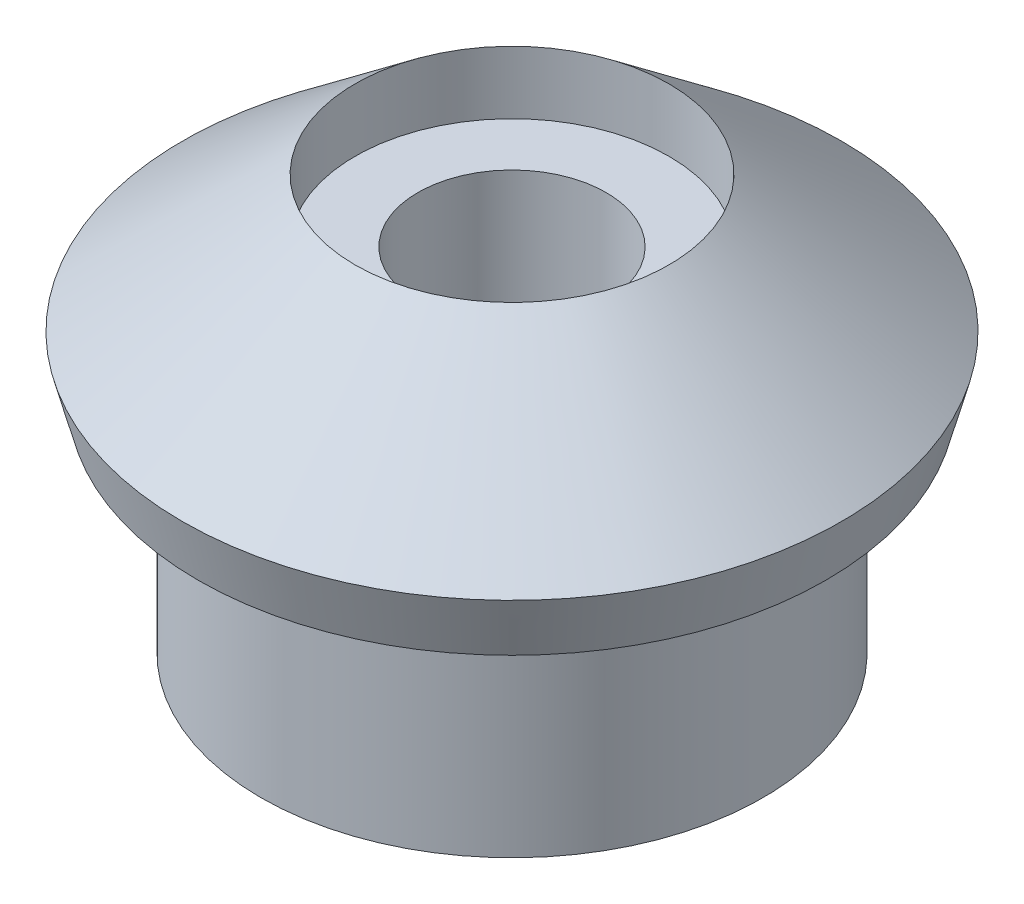
ISO-10303-21;
HEADER;
FILE_DESCRIPTION(('STEP AP214'),'2;1');
FILE_NAME('part.step','',(''),(''),'','','');
FILE_SCHEMA(('AUTOMOTIVE_DESIGN { 1 0 10303 214 1 1 1 1 }'));
ENDSEC;
DATA;
#1=APPLICATION_CONTEXT('core data for automotive mechanical design processes');
#2=APPLICATION_PROTOCOL_DEFINITION('international standard','automotive_design',2000,#1);
#3=PRODUCT_CONTEXT('',#1,'mechanical');
#4=PRODUCT('Part','Part','',(#3));
#5=PRODUCT_RELATED_PRODUCT_CATEGORY('part','',(#4));
#6=PRODUCT_DEFINITION_FORMATION('','',#4);
#7=PRODUCT_DEFINITION_CONTEXT('part definition',#1,'design');
#8=PRODUCT_DEFINITION('design','',#6,#7);
#9=PRODUCT_DEFINITION_SHAPE('','',#8);
#10=(LENGTH_UNIT() NAMED_UNIT(*) SI_UNIT(.MILLI.,.METRE.));
#11=(NAMED_UNIT(*) PLANE_ANGLE_UNIT() SI_UNIT($,.RADIAN.));
#12=(NAMED_UNIT(*) SI_UNIT($,.STERADIAN.) SOLID_ANGLE_UNIT());
#13=UNCERTAINTY_MEASURE_WITH_UNIT(LENGTH_MEASURE(1.E-05),#10,'distance_accuracy_value','');
#14=(GEOMETRIC_REPRESENTATION_CONTEXT(3) GLOBAL_UNCERTAINTY_ASSIGNED_CONTEXT((#13)) GLOBAL_UNIT_ASSIGNED_CONTEXT((#10,
#11,#12)) REPRESENTATION_CONTEXT('',''));
#15=CARTESIAN_POINT('',(0.,0.,0.));
#16=DIRECTION('',(0.,0.,1.));
#17=DIRECTION('',(1.,0.,0.));
#18=AXIS2_PLACEMENT_3D('',#15,#16,#17);
#19=CARTESIAN_POINT('',(0.,11.2,0.));
#20=DIRECTION('',(0.,-1.,0.));
#21=DIRECTION('',(0.,0.,1.));
#22=AXIS2_PLACEMENT_3D('',#19,#20,#21);
#23=PLANE('',#22);
#24=CARTESIAN_POINT('',(0.,11.2,0.));
#25=DIRECTION('',(0.,1.,0.));
#26=DIRECTION('',(0.,0.,1.));
#27=AXIS2_PLACEMENT_3D('',#24,#25,#26);
#28=CIRCLE('',#27,3.);
#29=CARTESIAN_POINT('',(0.,11.2,3.));
#30=VERTEX_POINT('',#29);
#31=EDGE_CURVE('E61',#30,#30,#28,.T.);
#32=ORIENTED_EDGE('',*,*,#31,.F.);
#33=EDGE_LOOP('',(#32));
#34=FACE_BOUND('',#33,.T.);
#35=CARTESIAN_POINT('',(0.,11.2,0.));
#36=DIRECTION('',(0.,-1.,0.));
#37=DIRECTION('',(0.,0.,-1.));
#38=AXIS2_PLACEMENT_3D('',#35,#36,#37);
#39=CIRCLE('',#38,5.);
#40=CARTESIAN_POINT('',(0.,11.2,-5.));
#41=VERTEX_POINT('',#40);
#42=EDGE_CURVE('E10',#41,#41,#39,.T.);
#43=ORIENTED_EDGE('',*,*,#42,.F.);
#44=EDGE_LOOP('',(#43));
#45=FACE_BOUND('',#44,.T.);
#46=ADVANCED_FACE('F32',(#34,#45),#23,.F.);
#47=CARTESIAN_POINT('',(0.,56.9416656123482,0.));
#48=DIRECTION('',(0.,1.,0.));
#49=DIRECTION('',(0.,0.,-1.));
#50=AXIS2_PLACEMENT_3D('',#47,#48,#49);
#51=CYLINDRICAL_SURFACE('',#50,5.);
#52=ORIENTED_EDGE('',*,*,#42,.T.);
#53=EDGE_LOOP('',(#52));
#54=FACE_BOUND('',#53,.T.);
#55=CARTESIAN_POINT('',(0.,13.2,0.));
#56=DIRECTION('',(0.,-1.,0.));
#57=DIRECTION('',(0.,0.,-1.));
#58=AXIS2_PLACEMENT_3D('',#55,#56,#57);
#59=CIRCLE('',#58,5.);
#60=CARTESIAN_POINT('',(0.,13.2,-5.));
#61=VERTEX_POINT('',#60);
#62=EDGE_CURVE('E43',#61,#61,#59,.T.);
#63=ORIENTED_EDGE('',*,*,#62,.F.);
#64=EDGE_LOOP('',(#63));
#65=FACE_BOUND('',#64,.T.);
#66=ADVANCED_FACE('F91',(#54,#65),#51,.F.);
#67=CARTESIAN_POINT('',(0.,8.86987298107782,0.));
#68=DIRECTION('',(0.,-1.,0.));
#69=DIRECTION('',(0.,0.,1.));
#70=AXIS2_PLACEMENT_3D('',#67,#68,#69);
#71=CONICAL_SURFACE('',#70,10.5,0.903849982291234);
#72=ORIENTED_EDGE('',*,*,#62,.T.);
#73=EDGE_LOOP('',(#72));
#74=FACE_BOUND('',#73,.T.);
#75=CARTESIAN_POINT('',(0.,8.86987298107782,0.));
#76=DIRECTION('',(0.,-1.,0.));
#77=DIRECTION('',(0.,0.,-1.));
#78=AXIS2_PLACEMENT_3D('',#75,#76,#77);
#79=CIRCLE('',#78,10.5);
#80=CARTESIAN_POINT('',(0.,8.86987298107782,-10.5));
#81=VERTEX_POINT('',#80);
#82=EDGE_CURVE('E47',#81,#81,#79,.T.);
#83=ORIENTED_EDGE('',*,*,#82,.F.);
#84=EDGE_LOOP('',(#83));
#85=FACE_BOUND('',#84,.T.);
#86=ADVANCED_FACE('F88',(#74,#85),#71,.T.);
#87=CARTESIAN_POINT('',(0.,7.,0.));
#88=DIRECTION('',(0.,1.,0.));
#89=DIRECTION('',(0.,0.,-1.));
#90=AXIS2_PLACEMENT_3D('',#87,#88,#89);
#91=CONICAL_SURFACE('',#90,10.,0.261284899996137);
#92=ORIENTED_EDGE('',*,*,#82,.T.);
#93=EDGE_LOOP('',(#92));
#94=FACE_BOUND('',#93,.T.);
#95=CARTESIAN_POINT('',(0.,7.,0.));
#96=DIRECTION('',(0.,-1.,0.));
#97=DIRECTION('',(0.,0.,-1.));
#98=AXIS2_PLACEMENT_3D('',#95,#96,#97);
#99=CIRCLE('',#98,10.);
#100=CARTESIAN_POINT('',(0.,7.,-10.));
#101=VERTEX_POINT('',#100);
#102=EDGE_CURVE('E52',#101,#101,#99,.T.);
#103=ORIENTED_EDGE('',*,*,#102,.F.);
#104=EDGE_LOOP('',(#103));
#105=FACE_BOUND('',#104,.T.);
#106=ADVANCED_FACE('F84',(#94,#105),#91,.T.);
#107=CARTESIAN_POINT('',(0.,7.,10.));
#108=DIRECTION('',(0.,1.,0.));
#109=DIRECTION('',(0.,0.,-1.));
#110=AXIS2_PLACEMENT_3D('',#107,#108,#109);
#111=PLANE('',#110);
#112=ORIENTED_EDGE('',*,*,#102,.T.);
#113=EDGE_LOOP('',(#112));
#114=FACE_BOUND('',#113,.T.);
#115=CARTESIAN_POINT('',(0.,7.,0.));
#116=DIRECTION('',(0.,-1.,0.));
#117=DIRECTION('',(0.,0.,-1.));
#118=AXIS2_PLACEMENT_3D('',#115,#116,#117);
#119=CIRCLE('',#118,8.);
#120=CARTESIAN_POINT('',(0.,7.,-8.));
#121=VERTEX_POINT('',#120);
#122=EDGE_CURVE('E55',#121,#121,#119,.T.);
#123=ORIENTED_EDGE('',*,*,#122,.F.);
#124=EDGE_LOOP('',(#123));
#125=FACE_BOUND('',#124,.T.);
#126=ADVANCED_FACE('F80',(#114,#125),#111,.F.);
#127=CARTESIAN_POINT('',(0.,56.9416656123482,0.));
#128=DIRECTION('',(0.,1.,0.));
#129=DIRECTION('',(0.,0.,-1.));
#130=AXIS2_PLACEMENT_3D('',#127,#128,#129);
#131=CYLINDRICAL_SURFACE('',#130,8.);
#132=CARTESIAN_POINT('',(-7.85811682275086,3.,1.5));
#133=CARTESIAN_POINT('',(-7.85811843793494,3.08345720801174,1.49999679883246));
#134=CARTESIAN_POINT('',(-7.85946079760266,3.16695594821839,1.49301126348936));
#135=CARTESIAN_POINT('',(-7.86467851014364,3.33159896158191,1.46527253251805));
#136=CARTESIAN_POINT('',(-7.86855601173205,3.41274117642748,1.44450765768477));
#137=CARTESIAN_POINT('',(-7.87838976464885,3.57026507137088,1.38987035617788));
#138=CARTESIAN_POINT('',(-7.88434407905997,3.64665110930729,1.35601013954374));
#139=CARTESIAN_POINT('',(-7.89765826320959,3.79265355928681,1.27617565760366));
#140=CARTESIAN_POINT('',(-7.90501802325622,3.8622704990033,1.23020233759193));
#141=CARTESIAN_POINT('',(-7.92041614838944,3.99363019919913,1.12683678942622));
#142=CARTESIAN_POINT('',(-7.92846116625679,4.05527648347173,1.06932292933092));
#143=CARTESIAN_POINT('',(-7.94426457664034,4.16810438959956,0.944771778803551));
#144=CARTESIAN_POINT('',(-7.95202295031153,4.21928532442479,0.877733863624944));
#145=CARTESIAN_POINT('',(-7.96645017828405,4.31009937660052,0.735403894570162));
#146=CARTESIAN_POINT('',(-7.97311028052363,4.34964153351942,0.660052840033865));
#147=CARTESIAN_POINT('',(-7.98451608632931,4.41546954227353,0.503631283250762));
#148=CARTESIAN_POINT('',(-7.98926194728334,4.44175648399022,0.422561251859505));
#149=CARTESIAN_POINT('',(-7.99625755123778,4.48002954861113,0.258002746187416));
#150=CARTESIAN_POINT('',(-7.99853565976327,4.49217830592269,0.174553323244857));
#151=CARTESIAN_POINT('',(-8.00043684615594,4.5023368877004,0.00677167603538285));
#152=CARTESIAN_POINT('',(-8.00006015010697,4.50034791613906,-0.0775604724476705));
#153=CARTESIAN_POINT('',(-7.99671633763241,4.48241222885285,-0.243598357899397));
#154=CARTESIAN_POINT('',(-7.99378172247214,4.46664063056999,-0.325323760451469));
#155=CARTESIAN_POINT('',(-7.98568826333561,4.42186435060476,-0.484947165715476));
#156=CARTESIAN_POINT('',(-7.98052933829966,4.3928591866542,-0.562845028826541));
#157=CARTESIAN_POINT('',(-7.96851260297339,4.3222722689417,-0.713110065751521));
#158=CARTESIAN_POINT('',(-7.96164537590825,4.2806205120875,-0.785443571838533));
#159=CARTESIAN_POINT('',(-7.9469714754285,4.18597433092285,-0.922159977214638));
#160=CARTESIAN_POINT('',(-7.93916470651164,4.13297875311242,-0.986542066910785));
#161=CARTESIAN_POINT('',(-7.92333513680567,4.01618429701647,-1.10656561896904));
#162=CARTESIAN_POINT('',(-7.91531085901622,3.95223221609793,-1.16205790757041));
#163=CARTESIAN_POINT('',(-7.90006508924621,3.81585046872137,-1.26155171851261));
#164=CARTESIAN_POINT('',(-7.89284360901351,3.74342067823536,-1.30555307271182));
#165=CARTESIAN_POINT('',(-7.88001893307121,3.59194172929734,-1.38085852224478));
#166=CARTESIAN_POINT('',(-7.87441850530261,3.51288154280936,-1.41214093645421));
#167=CARTESIAN_POINT('',(-7.86551242396689,3.3504988158768,-1.46093656975056));
#168=CARTESIAN_POINT('',(-7.8622065103862,3.26717675953522,-1.47845134901108));
#169=CARTESIAN_POINT('',(-7.85831520301005,3.09998067114412,-1.49899672649739));
#170=CARTESIAN_POINT('',(-7.85768955816136,3.01613388443449,-1.50224164285859));
#171=CARTESIAN_POINT('',(-7.8591219142084,2.84909654491285,-1.49472968881724));
#172=CARTESIAN_POINT('',(-7.86117978238611,2.76590595985192,-1.48397351086433));
#173=CARTESIAN_POINT('',(-7.86770980063205,2.60324709694561,-1.44894868195883));
#174=CARTESIAN_POINT('',(-7.87216186690878,2.5237537473751,-1.4247923858399));
#175=CARTESIAN_POINT('',(-7.88296134156619,2.36994281026984,-1.3637722437906));
#176=CARTESIAN_POINT('',(-7.88930888963281,2.29562560468467,-1.32690746128795));
#177=CARTESIAN_POINT('',(-7.90327577863685,2.15333238095683,-1.2410235311966));
#178=CARTESIAN_POINT('',(-7.91090895425315,2.08543946213393,-1.19186899639621));
#179=CARTESIAN_POINT('',(-7.926548113681,1.95878795978567,-1.08298344344247));
#180=CARTESIAN_POINT('',(-7.93455413096494,1.90003019844423,-1.02325147433084));
#181=CARTESIAN_POINT('',(-7.95016624005946,1.79251623646587,-0.893949417870385));
#182=CARTESIAN_POINT('',(-7.95776555833305,1.74390417339403,-0.82425853409589));
#183=CARTESIAN_POINT('',(-7.97159404810351,1.65907879382234,-0.67757452304014));
#184=CARTESIAN_POINT('',(-7.97782327234725,1.62286499997499,-0.600581677038528));
#185=CARTESIAN_POINT('',(-7.98818057995848,1.56407990213592,-0.441877541578684));
#186=CARTESIAN_POINT('',(-7.99231954730142,1.54143781243859,-0.360193213078987));
#187=CARTESIAN_POINT('',(-7.99807642083745,1.51021295171011,-0.19409622738157));
#188=CARTESIAN_POINT('',(-7.99969459229933,1.50162870133729,-0.10968385821585));
#189=CARTESIAN_POINT('',(-8.00022227515441,1.49881469848156,0.0580907602505099));
#190=CARTESIAN_POINT('',(-7.99917286625032,1.50436724687047,0.141449307066269));
#191=CARTESIAN_POINT('',(-7.99456866611703,1.52919242776844,0.3060233692792));
#192=CARTESIAN_POINT('',(-7.99101389890671,1.54846492874421,0.38723890521369));
#193=CARTESIAN_POINT('',(-7.98179837978045,1.60009120738372,0.545106475595485));
#194=CARTESIAN_POINT('',(-7.97614135981576,1.63242181288101,0.621766319318224));
#195=CARTESIAN_POINT('',(-7.96333372068771,1.70922045365518,0.768605631316695));
#196=CARTESIAN_POINT('',(-7.95618300146483,1.75368930210665,0.838784665003271));
#197=CARTESIAN_POINT('',(-7.94104779859941,1.85425145444232,0.971755027780007));
#198=CARTESIAN_POINT('',(-7.93305284591272,1.91050203386171,1.03442623539053));
#199=CARTESIAN_POINT('',(-7.91719633538833,2.03270456249271,1.14951536065485));
#200=CARTESIAN_POINT('',(-7.90933480936765,2.09865879037372,1.2019308632478));
#201=CARTESIAN_POINT('',(-7.89455577425926,2.23912645470334,1.29547633945385));
#202=CARTESIAN_POINT('',(-7.88764767280729,2.31371343966764,1.33649740531872));
#203=CARTESIAN_POINT('',(-7.87567084650033,2.46882578997974,1.40536132423417));
#204=CARTESIAN_POINT('',(-7.87060038649116,2.54934546658938,1.43321661638912));
#205=CARTESIAN_POINT('',(-7.86393016292125,2.69175228806592,1.46929726596175));
#206=CARTESIAN_POINT('',(-7.86176310717932,2.75280572376195,1.4807910573985));
#207=CARTESIAN_POINT('',(-7.85885585595504,2.87589846842032,1.49614351076215));
#208=CARTESIAN_POINT('',(-7.85811562163282,2.93793775050033,1.50000238052127));
#209=CARTESIAN_POINT('',(-7.85811682275086,3.,1.5));
#210=B_SPLINE_CURVE_WITH_KNOTS('',3,(#132,#133,#134,#135,#136,#137,#138,#139,#140,#141,#142,
#143,#144,#145,#146,#147,#148,#149,#150,#151,#152,#153,#154,#155,#156,#157,#158,#159,#160,#161,
#162,#163,#164,#165,#166,#167,#168,#169,#170,#171,#172,#173,#174,#175,#176,#177,#178,#179,#180,
#181,#182,#183,#184,#185,#186,#187,#188,#189,#190,#191,#192,#193,#194,#195,#196,#197,#198,#199,
#200,#201,#202,#203,#204,#205,#206,#207,#208,#209),.UNSPECIFIED.,.T.,.F.,(4,2,2,2,2,2,2,2,2,2,2,
2,2,2,2,2,2,2,2,2,2,2,2,2,2,2,2,2,2,2,2,2,2,2,2,2,2,2,4),(0.,0.250144505793187,
0.500501302380393,0.750625227978433,1.00072963993908,1.25362335698691,1.50653367069315,
1.76137104348047,2.0161874593964,2.26804275460261,2.51987660200648,2.76855650598725,
3.01724547328425,3.26733691984219,3.51745380911785,3.77140614764064,4.025362201924,
4.27974936118266,4.53410768866488,4.78463248587075,5.03514489338718,5.28358792315369,
5.53204926624317,5.78337862654144,6.03473059394677,6.28944125495871,6.54414210821705,
6.79750269418683,7.0508366166733,7.30029300570138,7.54974700322167,7.79876026530358,
8.0477902135711,8.30038464008745,8.55303847730765,8.80803001818118,9.06278015749119,
9.24880307527215,9.43482092920425),.UNSPECIFIED.);
#211=CARTESIAN_POINT('',(-7.85811682275086,3.,1.5));
#212=VERTEX_POINT('',#211);
#213=EDGE_CURVE('E67',#212,#212,#210,.T.);
#214=ORIENTED_EDGE('',*,*,#213,.F.);
#215=EDGE_LOOP('',(#214));
#216=FACE_BOUND('',#215,.T.);
#217=ORIENTED_EDGE('',*,*,#122,.T.);
#218=EDGE_LOOP('',(#217));
#219=FACE_BOUND('',#218,.T.);
#220=CARTESIAN_POINT('',(0.,0.,0.));
#221=DIRECTION('',(0.,-1.,0.));
#222=DIRECTION('',(0.,0.,-1.));
#223=AXIS2_PLACEMENT_3D('',#220,#221,#222);
#224=CIRCLE('',#223,8.);
#225=CARTESIAN_POINT('',(0.,0.,-8.));
#226=VERTEX_POINT('',#225);
#227=EDGE_CURVE('E58',#226,#226,#224,.T.);
#228=ORIENTED_EDGE('',*,*,#227,.F.);
#229=EDGE_LOOP('',(#228));
#230=FACE_BOUND('',#229,.T.);
#231=ADVANCED_FACE('F74',(#216,#219,#230),#131,.T.);
#232=CARTESIAN_POINT('',(0.,0.,8.));
#233=DIRECTION('',(0.,1.,0.));
#234=DIRECTION('',(0.,0.,-1.));
#235=AXIS2_PLACEMENT_3D('',#232,#233,#234);
#236=PLANE('',#235);
#237=CARTESIAN_POINT('',(0.,0.,0.));
#238=DIRECTION('',(0.,1.,0.));
#239=DIRECTION('',(0.,0.,1.));
#240=AXIS2_PLACEMENT_3D('',#237,#238,#239);
#241=CIRCLE('',#240,3.);
#242=CARTESIAN_POINT('',(0.,0.,3.));
#243=VERTEX_POINT('',#242);
#244=EDGE_CURVE('E64',#243,#243,#241,.T.);
#245=ORIENTED_EDGE('',*,*,#244,.T.);
#246=EDGE_LOOP('',(#245));
#247=FACE_BOUND('',#246,.T.);
#248=ORIENTED_EDGE('',*,*,#227,.T.);
#249=EDGE_LOOP('',(#248));
#250=FACE_BOUND('',#249,.T.);
#251=ADVANCED_FACE('F79',(#247,#250),#236,.F.);
#252=CARTESIAN_POINT('',(0.,13.2,0.));
#253=DIRECTION('',(0.,-1.,0.));
#254=DIRECTION('',(0.,0.,1.));
#255=AXIS2_PLACEMENT_3D('',#252,#253,#254);
#256=CYLINDRICAL_SURFACE('',#255,3.);
#257=CARTESIAN_POINT('',(-2.59807621135332,3.,1.5));
#258=CARTESIAN_POINT('',(-2.59808302092689,2.92183828770712,1.4999945446118));
#259=CARTESIAN_POINT('',(-2.60165701781635,2.84357788271243,1.49384995609983));
#260=CARTESIAN_POINT('',(-2.61543549678079,2.68945910298427,1.46958481484708));
#261=CARTESIAN_POINT('',(-2.62565391083339,2.61360612743489,1.45143909683127));
#262=CARTESIAN_POINT('',(-2.65124019908098,2.46682250348409,1.40414992304972));
#263=CARTESIAN_POINT('',(-2.66658065209878,2.39586802128962,1.3750649287406));
#264=CARTESIAN_POINT('',(-2.70063997225287,2.25986369700492,1.30690128806456));
#265=CARTESIAN_POINT('',(-2.71935902214097,2.19481417460631,1.26782210105366));
#266=CARTESIAN_POINT('',(-2.75995303586162,2.06654140716374,1.17699981079632));
#267=CARTESIAN_POINT('',(-2.7819609545693,2.00391129648968,1.12447805421566));
#268=CARTESIAN_POINT('',(-2.82557974178559,1.88788741738994,1.0098807114217));
#269=CARTESIAN_POINT('',(-2.84719040746875,1.83449825612472,0.94780038867344));
#270=CARTESIAN_POINT('',(-2.88932215429424,1.73494927327851,0.81073434512182));
#271=CARTESIAN_POINT('',(-2.90967159627259,1.6895193482107,0.735160783518863));
#272=CARTESIAN_POINT('',(-2.94526134149293,1.61228872013136,0.576235539899256));
#273=CARTESIAN_POINT('',(-2.96050486775612,1.58047941579424,0.492888807207233));
#274=CARTESIAN_POINT('',(-2.98320691866356,1.53374300804835,0.327067415888966));
#275=CARTESIAN_POINT('',(-2.99114220331338,1.5177757104667,0.244952685733227));
#276=CARTESIAN_POINT('',(-3.00011375769101,1.49975082198744,0.0788559430467725));
#277=CARTESIAN_POINT('',(-3.00115420176885,1.49768481480643,-0.00512490876560739));
#278=CARTESIAN_POINT('',(-2.99644472874675,1.50712001095552,-0.164748786635625));
#279=CARTESIAN_POINT('',(-2.99127743838241,1.51745702328183,-0.240481798765187));
#280=CARTESIAN_POINT('',(-2.97561367889621,1.54932126585699,-0.388970657877483));
#281=CARTESIAN_POINT('',(-2.96511681099591,1.57084933346433,-0.461726281640888));
#282=CARTESIAN_POINT('',(-2.93957374931482,1.62462384913472,-0.60346408735433));
#283=CARTESIAN_POINT('',(-2.92446662293799,1.6570144697581,-0.672380135272767));
#284=CARTESIAN_POINT('',(-2.89106468980031,1.73139512430224,-0.803965202269993));
#285=CARTESIAN_POINT('',(-2.87276874236226,1.77338859495352,-0.866631973257968));
#286=CARTESIAN_POINT('',(-2.83266591598844,1.87034302729952,-0.990260491347292));
#287=CARTESIAN_POINT('',(-2.81069063997263,1.92615454248901,-1.05050111254404));
#288=CARTESIAN_POINT('',(-2.76681510880218,2.04688458739526,-1.16115655544667));
#289=CARTESIAN_POINT('',(-2.74491492398443,2.11181005841109,-1.21156381736135));
#290=CARTESIAN_POINT('',(-2.70216234138727,2.25397228863613,-1.30425800196332));
#291=CARTESIAN_POINT('',(-2.68146479986061,2.33172903458132,-1.34582597246708));
#292=CARTESIAN_POINT('',(-2.64563175417864,2.4944065070385,-1.41497866950185));
#293=CARTESIAN_POINT('',(-2.63049045069101,2.57931964952634,-1.44257798731633));
#294=CARTESIAN_POINT('',(-2.60916953725552,2.74682176692419,-1.48077031653756));
#295=CARTESIAN_POINT('',(-2.60237483772745,2.82906167856533,-1.49253768317996));
#296=CARTESIAN_POINT('',(-2.59676879042414,2.99460201227481,-1.50227541991714));
#297=CARTESIAN_POINT('',(-2.59795180333967,3.07790164367968,-1.50025553597254));
#298=CARTESIAN_POINT('',(-2.60751504810877,3.23348087786809,-1.48355406501595));
#299=CARTESIAN_POINT('',(-2.61509381259981,3.30596917666189,-1.4702817250687));
#300=CARTESIAN_POINT('',(-2.63541032327012,3.44755167940644,-1.43354442694866));
#301=CARTESIAN_POINT('',(-2.64814974007551,3.51664477611991,-1.41007616793542));
#302=CARTESIAN_POINT('',(-2.67804333119485,3.65311699635404,-1.35247138290733));
#303=CARTESIAN_POINT('',(-2.69537464864595,3.72026852528033,-1.31789109553909));
#304=CARTESIAN_POINT('',(-2.73234179245875,3.84820390730849,-1.23943059602371));
#305=CARTESIAN_POINT('',(-2.75197880032721,3.90898446526993,-1.19554560649832));
#306=CARTESIAN_POINT('',(-2.79431997684504,4.03046815128532,-1.09325575079828));
#307=CARTESIAN_POINT('',(-2.81709874731434,4.09019572607649,-1.03371790847245));
#308=CARTESIAN_POINT('',(-2.86101352466839,4.19911835699039,-0.905106743097433));
#309=CARTESIAN_POINT('',(-2.88214897511564,4.24830985534581,-0.836030211983021));
#310=CARTESIAN_POINT('',(-2.92112042536435,4.33586058892515,-0.687803043838136));
#311=CARTESIAN_POINT('',(-2.93885462508044,4.37389967731637,-0.60843464636117));
#312=CARTESIAN_POINT('',(-2.96825032438951,4.43570685578609,-0.443283546961623));
#313=CARTESIAN_POINT('',(-2.9799171551456,4.45948747704946,-0.357506552088264));
#314=CARTESIAN_POINT('',(-2.99501262272824,4.49005284626199,-0.190469523495626));
#315=CARTESIAN_POINT('',(-2.99909891862287,4.49819681381417,-0.109517165775686));
#316=CARTESIAN_POINT('',(-3.00063195562697,4.5012648981816,0.052688978926805));
#317=CARTESIAN_POINT('',(-2.99808102100335,4.49619364278535,0.13394265044263));
#318=CARTESIAN_POINT('',(-2.98700953256884,4.47387538980656,0.28880698847572));
#319=CARTESIAN_POINT('',(-2.97889342001985,4.45745272611349,0.362568476716895));
#320=CARTESIAN_POINT('',(-2.95788140495135,4.41400950104554,0.506168928275426));
#321=CARTESIAN_POINT('',(-2.94498481699194,4.38698741985982,0.576007327433263));
#322=CARTESIAN_POINT('',(-2.9148889612218,4.32190942175104,0.713135109367327));
#323=CARTESIAN_POINT('',(-2.89752925798199,4.28343101518824,0.780187714050069));
#324=CARTESIAN_POINT('',(-2.86032199712739,4.19706310371143,0.907161962721037));
#325=CARTESIAN_POINT('',(-2.84047329837541,4.14916927632649,0.967080311122361));
#326=CARTESIAN_POINT('',(-2.79792915339941,4.03980429146595,1.08437100623534));
#327=CARTESIAN_POINT('',(-2.77514698517547,3.97745626878421,1.14089652680891));
#328=CARTESIAN_POINT('',(-2.73094614244278,3.84382391830534,1.24299493109201));
#329=CARTESIAN_POINT('',(-2.70952868642798,3.77253176869847,1.28855812501509));
#330=CARTESIAN_POINT('',(-2.66999407957374,3.62004503012857,1.36864661967848));
#331=CARTESIAN_POINT('',(-2.65200261384405,3.5386087033069,1.40277759894141));
#332=CARTESIAN_POINT('',(-2.62299234492527,3.37000139349033,1.45631806425962));
#333=CARTESIAN_POINT('',(-2.61195024221553,3.28285066663097,1.47577678676302));
#334=CARTESIAN_POINT('',(-2.60293908902686,3.16229196652201,1.49155051179662));
#335=CARTESIAN_POINT('',(-2.60112193507728,3.12994815840318,1.49471415744578));
#336=CARTESIAN_POINT('',(-2.59868903831625,3.06507527897664,1.49894010763494));
#337=CARTESIAN_POINT('',(-2.59807337587664,3.03254619542119,1.50000227159981));
#338=CARTESIAN_POINT('',(-2.59807621135332,3.,1.5));
#339=B_SPLINE_CURVE_WITH_KNOTS('',3,(#257,#258,#259,#260,#261,#262,#263,#264,#265,#266,#267,
#268,#269,#270,#271,#272,#273,#274,#275,#276,#277,#278,#279,#280,#281,#282,#283,#284,#285,#286,
#287,#288,#289,#290,#291,#292,#293,#294,#295,#296,#297,#298,#299,#300,#301,#302,#303,#304,#305,
#306,#307,#308,#309,#310,#311,#312,#313,#314,#315,#316,#317,#318,#319,#320,#321,#322,#323,#324,
#325,#326,#327,#328,#329,#330,#331,#332,#333,#334,#335,#336,#337,#338),.UNSPECIFIED.,.T.,.F.,(4,
2,2,2,2,2,2,2,2,2,2,2,2,2,2,2,2,2,2,2,2,2,2,2,2,2,2,2,2,2,2,2,2,2,2,2,2,2,2,2,4),(0.,
0.234348183892074,0.469189339237207,0.702792893878328,0.936409088167724,1.18929346874735,
1.44230356626556,1.71236838358145,1.98226240445837,2.23295227451903,2.4834903552906,
2.71224146226808,2.94100968776183,3.1729430209672,3.40495949025408,3.65890787185336,
3.91305072368878,4.18333262594173,4.45333161317557,4.70193436281318,4.9503613978256,
5.17161275136038,5.39293578654095,5.62450944609131,5.85620229330071,6.1171011537092,
6.37808797467303,6.64596272119449,6.91360169713157,7.1566840558423,7.39968130190957,
7.62666637307239,7.85368400268019,8.09041126079208,8.32724745151078,8.58765362775101,
8.84828914267731,9.11716123557907,9.3851269950414,9.48270202777964,9.58028358741811),.UNSPECIFIED.);
#340=CARTESIAN_POINT('',(-2.59807621135332,3.,1.5));
#341=VERTEX_POINT('',#340);
#342=EDGE_CURVE('E35',#341,#341,#339,.T.);
#343=ORIENTED_EDGE('',*,*,#342,.F.);
#344=EDGE_LOOP('',(#343));
#345=FACE_BOUND('',#344,.T.);
#346=ORIENTED_EDGE('',*,*,#244,.F.);
#347=EDGE_LOOP('',(#346));
#348=FACE_BOUND('',#347,.T.);
#349=ORIENTED_EDGE('',*,*,#31,.T.);
#350=EDGE_LOOP('',(#349));
#351=FACE_BOUND('',#350,.T.);
#352=ADVANCED_FACE('F111',(#345,#348,#351),#256,.F.);
#353=CARTESIAN_POINT('',(-10.5,3.,0.));
#354=DIRECTION('',(1.,0.,0.));
#355=DIRECTION('',(0.,0.,1.));
#356=AXIS2_PLACEMENT_3D('',#353,#354,#355);
#357=CYLINDRICAL_SURFACE('',#356,1.5);
#358=ORIENTED_EDGE('',*,*,#342,.T.);
#359=EDGE_LOOP('',(#358));
#360=FACE_BOUND('',#359,.T.);
#361=ORIENTED_EDGE('',*,*,#213,.T.);
#362=EDGE_LOOP('',(#361));
#363=FACE_BOUND('',#362,.T.);
#364=ADVANCED_FACE('F72',(#360,#363),#357,.F.);
#365=CLOSED_SHELL('',(#46,#66,#86,#106,#126,#231,#251,#352,#364));
#366=MANIFOLD_SOLID_BREP('B2',#365);
#367=ADVANCED_BREP_SHAPE_REPRESENTATION('',(#18,#366),#14);
#368=SHAPE_DEFINITION_REPRESENTATION(#9,#367);
ENDSEC;
END-ISO-10303-21;
